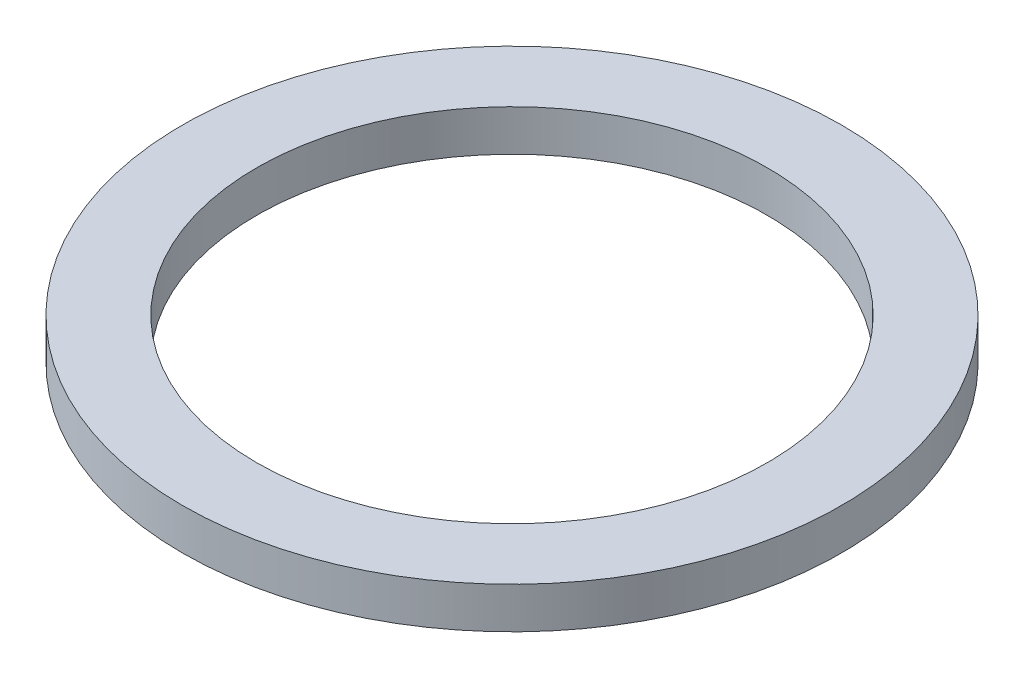
ISO-10303-21;
HEADER;
FILE_DESCRIPTION(('STEP AP214'),'2;1');
FILE_NAME('part.step','',(''),(''),'','','');
FILE_SCHEMA(('AUTOMOTIVE_DESIGN { 1 0 10303 214 1 1 1 1 }'));
ENDSEC;
DATA;
#1=APPLICATION_CONTEXT('core data for automotive mechanical design processes');
#2=APPLICATION_PROTOCOL_DEFINITION('international standard','automotive_design',2000,#1);
#3=PRODUCT_CONTEXT('',#1,'mechanical');
#4=PRODUCT('Part','Part','',(#3));
#5=PRODUCT_RELATED_PRODUCT_CATEGORY('part','',(#4));
#6=PRODUCT_DEFINITION_FORMATION('','',#4);
#7=PRODUCT_DEFINITION_CONTEXT('part definition',#1,'design');
#8=PRODUCT_DEFINITION('design','',#6,#7);
#9=PRODUCT_DEFINITION_SHAPE('','',#8);
#10=(LENGTH_UNIT() NAMED_UNIT(*) SI_UNIT(.MILLI.,.METRE.));
#11=(NAMED_UNIT(*) PLANE_ANGLE_UNIT() SI_UNIT($,.RADIAN.));
#12=(NAMED_UNIT(*) SI_UNIT($,.STERADIAN.) SOLID_ANGLE_UNIT());
#13=UNCERTAINTY_MEASURE_WITH_UNIT(LENGTH_MEASURE(1.E-05),#10,'distance_accuracy_value','');
#14=(GEOMETRIC_REPRESENTATION_CONTEXT(3) GLOBAL_UNCERTAINTY_ASSIGNED_CONTEXT((#13)) GLOBAL_UNIT_ASSIGNED_CONTEXT((#10,
#11,#12)) REPRESENTATION_CONTEXT('',''));
#15=CARTESIAN_POINT('',(0.,0.,0.));
#16=DIRECTION('',(0.,0.,1.));
#17=DIRECTION('',(1.,0.,0.));
#18=AXIS2_PLACEMENT_3D('',#15,#16,#17);
#19=CARTESIAN_POINT('',(0.,6.35,0.));
#20=DIRECTION('',(0.,1.,0.));
#21=DIRECTION('',(0.,0.,1.));
#22=AXIS2_PLACEMENT_3D('',#19,#20,#21);
#23=PLANE('',#22);
#24=CARTESIAN_POINT('',(0.,6.35,0.));
#25=DIRECTION('',(0.,1.,0.));
#26=DIRECTION('',(0.,0.,1.));
#27=AXIS2_PLACEMENT_3D('',#24,#25,#26);
#28=CIRCLE('',#27,50.8);
#29=CARTESIAN_POINT('',(0.,6.35,50.8));
#30=VERTEX_POINT('',#29);
#31=EDGE_CURVE('E10',#30,#30,#28,.T.);
#32=ORIENTED_EDGE('',*,*,#31,.T.);
#33=EDGE_LOOP('',(#32));
#34=FACE_BOUND('',#33,.T.);
#35=CARTESIAN_POINT('',(0.,6.35,0.));
#36=DIRECTION('',(0.,1.,0.));
#37=DIRECTION('',(0.,0.,1.));
#38=AXIS2_PLACEMENT_3D('',#35,#36,#37);
#39=CIRCLE('',#38,39.37);
#40=CARTESIAN_POINT('',(0.,6.35,39.37));
#41=VERTEX_POINT('',#40);
#42=EDGE_CURVE('E50',#41,#41,#39,.T.);
#43=ORIENTED_EDGE('',*,*,#42,.F.);
#44=EDGE_LOOP('',(#43));
#45=FACE_BOUND('',#44,.T.);
#46=ADVANCED_FACE('F37',(#34,#45),#23,.T.);
#47=CARTESIAN_POINT('',(0.,0.,0.));
#48=DIRECTION('',(0.,1.,0.));
#49=DIRECTION('',(0.,0.,1.));
#50=AXIS2_PLACEMENT_3D('',#47,#48,#49);
#51=PLANE('',#50);
#52=CARTESIAN_POINT('',(0.,0.,0.));
#53=DIRECTION('',(0.,1.,0.));
#54=DIRECTION('',(0.,0.,1.));
#55=AXIS2_PLACEMENT_3D('',#52,#53,#54);
#56=CIRCLE('',#55,50.8);
#57=CARTESIAN_POINT('',(0.,0.,50.8));
#58=VERTEX_POINT('',#57);
#59=EDGE_CURVE('E41',#58,#58,#56,.T.);
#60=ORIENTED_EDGE('',*,*,#59,.F.);
#61=EDGE_LOOP('',(#60));
#62=FACE_BOUND('',#61,.T.);
#63=CARTESIAN_POINT('',(0.,0.,0.));
#64=DIRECTION('',(0.,1.,0.));
#65=DIRECTION('',(0.,0.,1.));
#66=AXIS2_PLACEMENT_3D('',#63,#64,#65);
#67=CIRCLE('',#66,39.37);
#68=CARTESIAN_POINT('',(0.,0.,39.37));
#69=VERTEX_POINT('',#68);
#70=EDGE_CURVE('E52',#69,#69,#67,.T.);
#71=ORIENTED_EDGE('',*,*,#70,.T.);
#72=EDGE_LOOP('',(#71));
#73=FACE_BOUND('',#72,.T.);
#74=ADVANCED_FACE('F64',(#62,#73),#51,.F.);
#75=CARTESIAN_POINT('',(0.,6.35,0.));
#76=DIRECTION('',(0.,-1.,0.));
#77=DIRECTION('',(0.,0.,-1.));
#78=AXIS2_PLACEMENT_3D('',#75,#76,#77);
#79=CYLINDRICAL_SURFACE('',#78,50.8);
#80=ORIENTED_EDGE('',*,*,#31,.F.);
#81=EDGE_LOOP('',(#80));
#82=FACE_BOUND('',#81,.T.);
#83=ORIENTED_EDGE('',*,*,#59,.T.);
#84=EDGE_LOOP('',(#83));
#85=FACE_BOUND('',#84,.T.);
#86=ADVANCED_FACE('F39',(#82,#85),#79,.T.);
#87=CARTESIAN_POINT('',(0.,6.35,0.));
#88=DIRECTION('',(0.,-1.,0.));
#89=DIRECTION('',(0.,0.,-1.));
#90=AXIS2_PLACEMENT_3D('',#87,#88,#89);
#91=CYLINDRICAL_SURFACE('',#90,39.37);
#92=ORIENTED_EDGE('',*,*,#42,.T.);
#93=EDGE_LOOP('',(#92));
#94=FACE_BOUND('',#93,.T.);
#95=ORIENTED_EDGE('',*,*,#70,.F.);
#96=EDGE_LOOP('',(#95));
#97=FACE_BOUND('',#96,.T.);
#98=ADVANCED_FACE('F60',(#94,#97),#91,.F.);
#99=CLOSED_SHELL('',(#46,#74,#86,#98));
#100=MANIFOLD_SOLID_BREP('B2',#99);
#101=ADVANCED_BREP_SHAPE_REPRESENTATION('',(#18,#100),#14);
#102=SHAPE_DEFINITION_REPRESENTATION(#9,#101);
ENDSEC;
END-ISO-10303-21;
